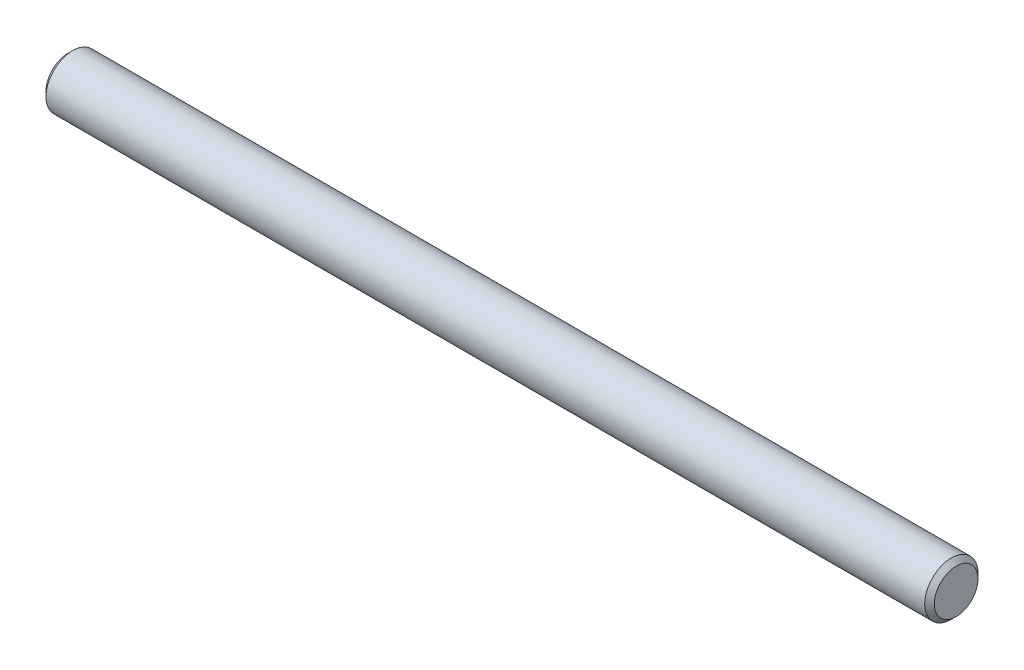
ISO-10303-21;
HEADER;
FILE_DESCRIPTION(('STEP AP214'),'2;1');
FILE_NAME('part.step','',(''),(''),'','','');
FILE_SCHEMA(('AUTOMOTIVE_DESIGN { 1 0 10303 214 1 1 1 1 }'));
ENDSEC;
DATA;
#1=APPLICATION_CONTEXT('core data for automotive mechanical design processes');
#2=APPLICATION_PROTOCOL_DEFINITION('international standard','automotive_design',2000,#1);
#3=PRODUCT_CONTEXT('',#1,'mechanical');
#4=PRODUCT('Part','Part','',(#3));
#5=PRODUCT_RELATED_PRODUCT_CATEGORY('part','',(#4));
#6=PRODUCT_DEFINITION_FORMATION('','',#4);
#7=PRODUCT_DEFINITION_CONTEXT('part definition',#1,'design');
#8=PRODUCT_DEFINITION('design','',#6,#7);
#9=PRODUCT_DEFINITION_SHAPE('','',#8);
#10=(LENGTH_UNIT() NAMED_UNIT(*) SI_UNIT(.MILLI.,.METRE.));
#11=(NAMED_UNIT(*) PLANE_ANGLE_UNIT() SI_UNIT($,.RADIAN.));
#12=(NAMED_UNIT(*) SI_UNIT($,.STERADIAN.) SOLID_ANGLE_UNIT());
#13=UNCERTAINTY_MEASURE_WITH_UNIT(LENGTH_MEASURE(1.E-05),#10,'distance_accuracy_value','');
#14=(GEOMETRIC_REPRESENTATION_CONTEXT(3) GLOBAL_UNCERTAINTY_ASSIGNED_CONTEXT((#13)) GLOBAL_UNIT_ASSIGNED_CONTEXT((#10,
#11,#12)) REPRESENTATION_CONTEXT('',''));
#15=CARTESIAN_POINT('',(0.,0.,0.));
#16=DIRECTION('',(0.,0.,1.));
#17=DIRECTION('',(1.,0.,0.));
#18=AXIS2_PLACEMENT_3D('',#15,#16,#17);
#19=CARTESIAN_POINT('',(0.,0.,0.));
#20=DIRECTION('',(1.,0.,0.));
#21=DIRECTION('',(0.,0.,-1.));
#22=AXIS2_PLACEMENT_3D('',#19,#20,#21);
#23=PLANE('',#22);
#24=CARTESIAN_POINT('',(0.,0.,0.));
#25=DIRECTION('',(-1.,0.,0.));
#26=DIRECTION('',(0.,0.,1.));
#27=AXIS2_PLACEMENT_3D('',#24,#25,#26);
#28=CIRCLE('',#27,2.46);
#29=CARTESIAN_POINT('',(0.,0.,2.46));
#30=VERTEX_POINT('',#29);
#31=EDGE_CURVE('E10',#30,#30,#28,.T.);
#32=ORIENTED_EDGE('',*,*,#31,.T.);
#33=EDGE_LOOP('',(#32));
#34=FACE_BOUND('',#33,.T.);
#35=ADVANCED_FACE('F34',(#34),#23,.F.);
#36=CARTESIAN_POINT('',(0.54,0.,0.));
#37=DIRECTION('',(1.,0.,0.));
#38=DIRECTION('',(0.,0.,-1.));
#39=AXIS2_PLACEMENT_3D('',#36,#37,#38);
#40=CONICAL_SURFACE('',#39,3.,0.78539816339745);
#41=ORIENTED_EDGE('',*,*,#31,.F.);
#42=EDGE_LOOP('',(#41));
#43=FACE_BOUND('',#42,.T.);
#44=CARTESIAN_POINT('',(0.54,0.,0.));
#45=DIRECTION('',(-1.,0.,0.));
#46=DIRECTION('',(0.,0.,1.));
#47=AXIS2_PLACEMENT_3D('',#44,#45,#46);
#48=CIRCLE('',#47,3.);
#49=CARTESIAN_POINT('',(0.54,0.,3.));
#50=VERTEX_POINT('',#49);
#51=EDGE_CURVE('E40',#50,#50,#48,.T.);
#52=ORIENTED_EDGE('',*,*,#51,.T.);
#53=EDGE_LOOP('',(#52));
#54=FACE_BOUND('',#53,.T.);
#55=ADVANCED_FACE('F66',(#43,#54),#40,.T.);
#56=CARTESIAN_POINT('',(0.,0.,0.));
#57=DIRECTION('',(-1.,0.,0.));
#58=DIRECTION('',(0.,0.,1.));
#59=AXIS2_PLACEMENT_3D('',#56,#57,#58);
#60=CYLINDRICAL_SURFACE('',#59,3.);
#61=ORIENTED_EDGE('',*,*,#51,.F.);
#62=EDGE_LOOP('',(#61));
#63=FACE_BOUND('',#62,.T.);
#64=CARTESIAN_POINT('',(99.46,0.,0.));
#65=DIRECTION('',(-1.,0.,0.));
#66=DIRECTION('',(0.,0.,1.));
#67=AXIS2_PLACEMENT_3D('',#64,#65,#66);
#68=CIRCLE('',#67,3.);
#69=CARTESIAN_POINT('',(99.46,0.,3.));
#70=VERTEX_POINT('',#69);
#71=EDGE_CURVE('E44',#70,#70,#68,.T.);
#72=ORIENTED_EDGE('',*,*,#71,.T.);
#73=EDGE_LOOP('',(#72));
#74=FACE_BOUND('',#73,.T.);
#75=ADVANCED_FACE('F62',(#63,#74),#60,.T.);
#76=CARTESIAN_POINT('',(100.,0.,0.));
#77=DIRECTION('',(-1.,0.,0.));
#78=DIRECTION('',(0.,0.,1.));
#79=AXIS2_PLACEMENT_3D('',#76,#77,#78);
#80=CONICAL_SURFACE('',#79,2.46,0.785398163397451);
#81=ORIENTED_EDGE('',*,*,#71,.F.);
#82=EDGE_LOOP('',(#81));
#83=FACE_BOUND('',#82,.T.);
#84=CARTESIAN_POINT('',(100.,0.,0.));
#85=DIRECTION('',(-1.,0.,0.));
#86=DIRECTION('',(0.,0.,1.));
#87=AXIS2_PLACEMENT_3D('',#84,#85,#86);
#88=CIRCLE('',#87,2.46);
#89=CARTESIAN_POINT('',(100.,0.,2.46));
#90=VERTEX_POINT('',#89);
#91=EDGE_CURVE('E48',#90,#90,#88,.T.);
#92=ORIENTED_EDGE('',*,*,#91,.T.);
#93=EDGE_LOOP('',(#92));
#94=FACE_BOUND('',#93,.T.);
#95=ADVANCED_FACE('F54',(#83,#94),#80,.T.);
#96=CARTESIAN_POINT('',(100.,2.46,0.));
#97=DIRECTION('',(-1.,0.,0.));
#98=DIRECTION('',(0.,0.,1.));
#99=AXIS2_PLACEMENT_3D('',#96,#97,#98);
#100=PLANE('',#99);
#101=ORIENTED_EDGE('',*,*,#91,.F.);
#102=EDGE_LOOP('',(#101));
#103=FACE_BOUND('',#102,.T.);
#104=ADVANCED_FACE('F56',(#103),#100,.F.);
#105=CLOSED_SHELL('',(#35,#55,#75,#95,#104));
#106=MANIFOLD_SOLID_BREP('B2',#105);
#107=ADVANCED_BREP_SHAPE_REPRESENTATION('',(#18,#106),#14);
#108=SHAPE_DEFINITION_REPRESENTATION(#9,#107);
ENDSEC;
END-ISO-10303-21;
